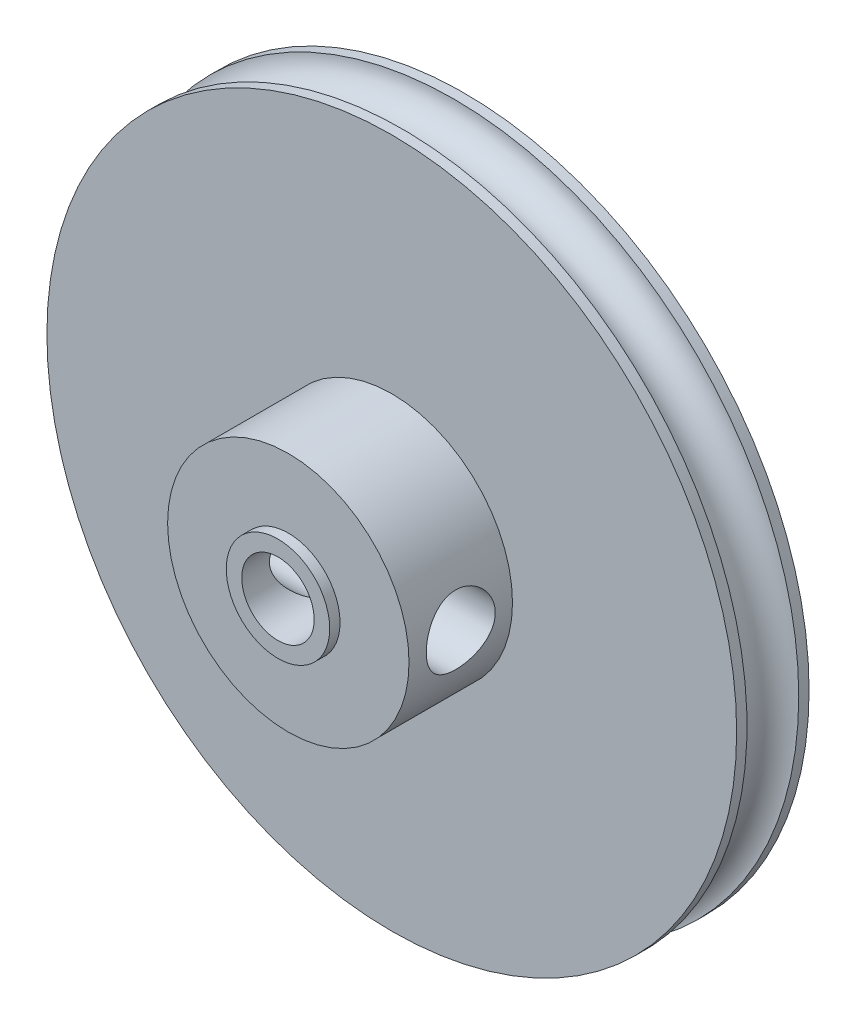
ISO-10303-21;
HEADER;
FILE_DESCRIPTION(('STEP AP214'),'2;1');
FILE_NAME('part.step','',(''),(''),'','','');
FILE_SCHEMA(('AUTOMOTIVE_DESIGN { 1 0 10303 214 1 1 1 1 }'));
ENDSEC;
DATA;
#1=APPLICATION_CONTEXT('core data for automotive mechanical design processes');
#2=APPLICATION_PROTOCOL_DEFINITION('international standard','automotive_design',2000,#1);
#3=PRODUCT_CONTEXT('',#1,'mechanical');
#4=PRODUCT('Part','Part','',(#3));
#5=PRODUCT_RELATED_PRODUCT_CATEGORY('part','',(#4));
#6=PRODUCT_DEFINITION_FORMATION('','',#4);
#7=PRODUCT_DEFINITION_CONTEXT('part definition',#1,'design');
#8=PRODUCT_DEFINITION('design','',#6,#7);
#9=PRODUCT_DEFINITION_SHAPE('','',#8);
#10=(LENGTH_UNIT() NAMED_UNIT(*) SI_UNIT(.MILLI.,.METRE.));
#11=(NAMED_UNIT(*) PLANE_ANGLE_UNIT() SI_UNIT($,.RADIAN.));
#12=(NAMED_UNIT(*) SI_UNIT($,.STERADIAN.) SOLID_ANGLE_UNIT());
#13=UNCERTAINTY_MEASURE_WITH_UNIT(LENGTH_MEASURE(1.E-05),#10,'distance_accuracy_value','');
#14=(GEOMETRIC_REPRESENTATION_CONTEXT(3) GLOBAL_UNCERTAINTY_ASSIGNED_CONTEXT((#13)) GLOBAL_UNIT_ASSIGNED_CONTEXT((#10,
#11,#12)) REPRESENTATION_CONTEXT('',''));
#15=CARTESIAN_POINT('',(0.,0.,0.));
#16=DIRECTION('',(0.,0.,1.));
#17=DIRECTION('',(1.,0.,0.));
#18=AXIS2_PLACEMENT_3D('',#15,#16,#17);
#19=CARTESIAN_POINT('',(0.,0.,0.));
#20=DIRECTION('',(0.,0.,1.));
#21=DIRECTION('',(1.,0.,0.));
#22=AXIS2_PLACEMENT_3D('',#19,#20,#21);
#23=PLANE('',#22);
#24=CARTESIAN_POINT('',(0.,0.,0.));
#25=DIRECTION('',(0.,0.,1.));
#26=DIRECTION('',(1.,0.,0.));
#27=AXIS2_PLACEMENT_3D('',#24,#25,#26);
#28=CIRCLE('',#27,20.);
#29=CARTESIAN_POINT('',(20.,0.,0.));
#30=VERTEX_POINT('',#29);
#31=EDGE_CURVE('E41',#30,#30,#28,.T.);
#32=ORIENTED_EDGE('',*,*,#31,.F.);
#33=EDGE_LOOP('',(#32));
#34=FACE_BOUND('',#33,.T.);
#35=CARTESIAN_POINT('',(0.,0.,0.));
#36=DIRECTION('',(0.,0.,1.));
#37=DIRECTION('',(1.,0.,0.));
#38=AXIS2_PLACEMENT_3D('',#35,#36,#37);
#39=CIRCLE('',#38,3.);
#40=CARTESIAN_POINT('',(3.,0.,0.));
#41=VERTEX_POINT('',#40);
#42=EDGE_CURVE('E10',#41,#41,#39,.F.);
#43=ORIENTED_EDGE('',*,*,#42,.F.);
#44=EDGE_LOOP('',(#43));
#45=FACE_BOUND('',#44,.T.);
#46=ADVANCED_FACE('F30',(#34,#45),#23,.F.);
#47=CARTESIAN_POINT('',(0.,0.,10.2));
#48=DIRECTION('',(0.,0.,1.));
#49=DIRECTION('',(1.,0.,0.));
#50=AXIS2_PLACEMENT_3D('',#47,#48,#49);
#51=PLANE('',#50);
#52=CARTESIAN_POINT('',(0.,0.,10.2));
#53=DIRECTION('',(0.,0.,1.));
#54=DIRECTION('',(1.,0.,0.));
#55=AXIS2_PLACEMENT_3D('',#52,#53,#54);
#56=CIRCLE('',#55,7.);
#57=CARTESIAN_POINT('',(7.,0.,10.2));
#58=VERTEX_POINT('',#57);
#59=EDGE_CURVE('E46',#58,#58,#56,.T.);
#60=ORIENTED_EDGE('',*,*,#59,.T.);
#61=EDGE_LOOP('',(#60));
#62=FACE_BOUND('',#61,.T.);
#63=CARTESIAN_POINT('',(0.,0.,10.2));
#64=DIRECTION('',(0.,0.,1.));
#65=DIRECTION('',(1.,0.,0.));
#66=AXIS2_PLACEMENT_3D('',#63,#64,#65);
#67=CIRCLE('',#66,3.);
#68=CARTESIAN_POINT('',(3.,0.,10.2));
#69=VERTEX_POINT('',#68);
#70=EDGE_CURVE('E97',#69,#69,#67,.T.);
#71=ORIENTED_EDGE('',*,*,#70,.F.);
#72=EDGE_LOOP('',(#71));
#73=FACE_BOUND('',#72,.T.);
#74=ADVANCED_FACE('F112',(#62,#73),#51,.T.);
#75=CARTESIAN_POINT('',(0.,0.,4.2));
#76=DIRECTION('',(0.,0.,-1.));
#77=DIRECTION('',(-1.,0.,0.));
#78=AXIS2_PLACEMENT_3D('',#75,#76,#77);
#79=CYLINDRICAL_SURFACE('',#78,20.);
#80=CARTESIAN_POINT('',(0.,0.,0.599999999999998));
#81=DIRECTION('',(0.,0.,1.));
#82=DIRECTION('',(1.,0.,0.));
#83=AXIS2_PLACEMENT_3D('',#80,#81,#82);
#84=CIRCLE('',#83,20.);
#85=CARTESIAN_POINT('',(20.,0.,0.599999999999998));
#86=VERTEX_POINT('',#85);
#87=EDGE_CURVE('E55',#86,#86,#84,.F.);
#88=ORIENTED_EDGE('',*,*,#87,.T.);
#89=EDGE_LOOP('',(#88));
#90=FACE_BOUND('',#89,.T.);
#91=ORIENTED_EDGE('',*,*,#31,.T.);
#92=EDGE_LOOP('',(#91));
#93=FACE_BOUND('',#92,.T.);
#94=ADVANCED_FACE('F110',(#90,#93),#79,.T.);
#95=CARTESIAN_POINT('',(0.,0.,4.2));
#96=DIRECTION('',(0.,0.,1.));
#97=DIRECTION('',(1.,0.,0.));
#98=AXIS2_PLACEMENT_3D('',#95,#96,#97);
#99=PLANE('',#98);
#100=CARTESIAN_POINT('',(0.,0.,4.2));
#101=DIRECTION('',(0.,0.,1.));
#102=DIRECTION('',(1.,0.,0.));
#103=AXIS2_PLACEMENT_3D('',#100,#101,#102);
#104=CIRCLE('',#103,20.);
#105=CARTESIAN_POINT('',(20.,0.,4.2));
#106=VERTEX_POINT('',#105);
#107=EDGE_CURVE('E37',#106,#106,#104,.T.);
#108=ORIENTED_EDGE('',*,*,#107,.T.);
#109=EDGE_LOOP('',(#108));
#110=FACE_BOUND('',#109,.T.);
#111=CARTESIAN_POINT('',(0.,0.,4.2));
#112=DIRECTION('',(0.,0.,1.));
#113=DIRECTION('',(1.,0.,0.));
#114=AXIS2_PLACEMENT_3D('',#111,#112,#113);
#115=CIRCLE('',#114,7.);
#116=CARTESIAN_POINT('',(7.,0.,4.2));
#117=VERTEX_POINT('',#116);
#118=EDGE_CURVE('E49',#117,#117,#115,.T.);
#119=ORIENTED_EDGE('',*,*,#118,.F.);
#120=EDGE_LOOP('',(#119));
#121=FACE_BOUND('',#120,.T.);
#122=ADVANCED_FACE('F107',(#110,#121),#99,.T.);
#123=CARTESIAN_POINT('',(0.,0.,3.6));
#124=DIRECTION('',(0.,0.,-1.));
#125=DIRECTION('',(-1.,0.,0.));
#126=AXIS2_PLACEMENT_3D('',#123,#124,#125);
#127=CIRCLE('',#126,20.);
#128=CARTESIAN_POINT('',(-20.,0.,3.6));
#129=VERTEX_POINT('',#128);
#130=EDGE_CURVE('E52',#129,#129,#127,.F.);
#131=ORIENTED_EDGE('',*,*,#130,.T.);
#132=EDGE_LOOP('',(#131));
#133=FACE_BOUND('',#132,.T.);
#134=ORIENTED_EDGE('',*,*,#107,.F.);
#135=EDGE_LOOP('',(#134));
#136=FACE_BOUND('',#135,.T.);
#137=ADVANCED_FACE('F32',(#133,#136),#79,.T.);
#138=CARTESIAN_POINT('',(0.,0.,4.2));
#139=DIRECTION('',(0.,0.,-1.));
#140=DIRECTION('',(-1.,0.,0.));
#141=AXIS2_PLACEMENT_3D('',#138,#139,#140);
#142=CYLINDRICAL_SURFACE('',#141,2.1);
#143=CARTESIAN_POINT('',(-2.1,0.,9.2));
#144=CARTESIAN_POINT('',(-2.09999936444777,-0.0909120531068295,9.19999936305237));
#145=CARTESIAN_POINT('',(-2.09404941407997,-0.181828497305162,9.19375459101171));
#146=CARTESIAN_POINT('',(-2.07078384019785,-0.360540363713051,9.16930433295639));
#147=CARTESIAN_POINT('',(-2.05346171614841,-0.448333970577751,9.15109200607077));
#148=CARTESIAN_POINT('',(-2.00898342535596,-0.617752164760208,9.10422387344634));
#149=CARTESIAN_POINT('',(-1.9818897584973,-0.699412060785336,9.07563443359822));
#150=CARTESIAN_POINT('',(-1.91959273879482,-0.855719551880911,9.00968314796344));
#151=CARTESIAN_POINT('',(-1.88438685005886,-0.930364943913561,8.97231855898227));
#152=CARTESIAN_POINT('',(-1.79191274069521,-1.10086565324553,8.87372470670245));
#153=CARTESIAN_POINT('',(-1.73149961401722,-1.19297264887869,8.80897455281074));
#154=CARTESIAN_POINT('',(-1.60203584972586,-1.36193273621251,8.66876143036656));
#155=CARTESIAN_POINT('',(-1.53295940057579,-1.43873839097887,8.59326635373053));
#156=CARTESIAN_POINT('',(-1.41438045254193,-1.55364491436854,8.46134507019631));
#157=CARTESIAN_POINT('',(-1.36628819985549,-1.59598675522613,8.4072570270299));
#158=CARTESIAN_POINT('',(-1.26883193822509,-1.6745089037211,8.29575364466363));
#159=CARTESIAN_POINT('',(-1.21946704621056,-1.71068479274555,8.23833595855358));
#160=CARTESIAN_POINT('',(-1.12070320230365,-1.77695097063386,8.1203362412893));
#161=CARTESIAN_POINT('',(-1.07130445585054,-1.80705164351893,8.05975983610313));
#162=CARTESIAN_POINT('',(-0.973962609140539,-1.86131075474689,7.93495559028042));
#163=CARTESIAN_POINT('',(-0.926017866095766,-1.88547613630838,7.87073212542661));
#164=CARTESIAN_POINT('',(-0.84841520650111,-1.92130932050872,7.75761684719065));
#165=CARTESIAN_POINT('',(-0.817629316139007,-1.93454304647024,7.71000027350925));
#166=CARTESIAN_POINT('',(-0.760126979235264,-1.95784505092686,7.61158254693046));
#167=CARTESIAN_POINT('',(-0.733405575839399,-1.96791720134334,7.56078538146299));
#168=CARTESIAN_POINT('',(-0.69450846594095,-1.98190672778,7.47099962551348));
#169=CARTESIAN_POINT('',(-0.680373525703797,-1.98676400765165,7.4330345194245));
#170=CARTESIAN_POINT('',(-0.657829437137729,-1.99434297697246,7.3552787967315));
#171=CARTESIAN_POINT('',(-0.649400829326005,-1.99707192923939,7.3154948832122));
#172=CARTESIAN_POINT('',(-0.639965795108926,-2.00011881853774,7.23439226072864));
#173=CARTESIAN_POINT('',(-0.639052841206742,-2.00040639342535,7.19306062732735));
#174=CARTESIAN_POINT('',(-0.64515784954926,-1.99844380249053,7.11103768097719));
#175=CARTESIAN_POINT('',(-0.652188079152923,-1.99618971135993,7.07034745713654));
#176=CARTESIAN_POINT('',(-0.675436245609076,-1.98845814436831,6.97933884177808));
#177=CARTESIAN_POINT('',(-0.693725310326469,-1.98223623016253,6.92964469333624));
#178=CARTESIAN_POINT('',(-0.736539578377773,-1.96673102295777,6.83344260453791));
#179=CARTESIAN_POINT('',(-0.761096165254037,-1.9574322515358,6.78695223992798));
#180=CARTESIAN_POINT('',(-0.823231060740887,-1.93229915917793,6.6801608351375));
#181=CARTESIAN_POINT('',(-0.862290661681386,-1.91531819586204,6.62101292525002));
#182=CARTESIAN_POINT('',(-0.943252568509887,-1.87678065714102,6.50620026331942));
#183=CARTESIAN_POINT('',(-0.985159700877122,-1.85521617420299,6.45054174890676));
#184=CARTESIAN_POINT('',(-1.07013735612331,-1.80753607339194,6.34189924015804));
#185=CARTESIAN_POINT('',(-1.113210440254,-1.78140960845504,6.28892201738371));
#186=CARTESIAN_POINT('',(-1.19931902028534,-1.72461484824843,6.18551507400742));
#187=CARTESIAN_POINT('',(-1.24235452043206,-1.69394992515622,6.13508349892652));
#188=CARTESIAN_POINT('',(-1.32914132853706,-1.6268048697706,6.03498566810869));
#189=CARTESIAN_POINT('',(-1.37286632155656,-1.59016096172804,5.98540544115068));
#190=CARTESIAN_POINT('',(-1.45878563740136,-1.51173316783222,5.88907425338676));
#191=CARTESIAN_POINT('',(-1.5009794407027,-1.46994755815747,5.84232424932983));
#192=CARTESIAN_POINT('',(-1.62396024510687,-1.33688790001762,5.70713007675995));
#193=CARTESIAN_POINT('',(-1.70157530932329,-1.23759290888488,5.6232567202644));
#194=CARTESIAN_POINT('',(-1.81798442545077,-1.0547049655713,5.49842029571049));
#195=CARTESIAN_POINT('',(-1.86103414440807,-0.977143981587388,5.45253434502256));
#196=CARTESIAN_POINT('',(-1.93838124715731,-0.81295174408234,5.37037783010725));
#197=CARTESIAN_POINT('',(-1.97268161372561,-0.726323595926394,5.33410398881337));
#198=CARTESIAN_POINT('',(-2.03043383974987,-0.544529390795856,5.27314854760022));
#199=CARTESIAN_POINT('',(-2.0537761128825,-0.449287995888474,5.24858401055333));
#200=CARTESIAN_POINT('',(-2.08692870065803,-0.253964270787182,5.21372169622361));
#201=CARTESIAN_POINT('',(-2.09675577235228,-0.153888094813077,5.20340625189213));
#202=CARTESIAN_POINT('',(-2.10151219360728,0.0324394985192102,5.19841237879532));
#203=CARTESIAN_POINT('',(-2.09839156703384,0.118595849497538,5.20168717184827));
#204=CARTESIAN_POINT('',(-2.08180595299683,0.288772158327035,5.21911048265459));
#205=CARTESIAN_POINT('',(-2.06834065417288,0.37279205179514,5.23325932770192));
#206=CARTESIAN_POINT('',(-2.0327200925021,0.533468828273225,5.27075564767061));
#207=CARTESIAN_POINT('',(-2.0108914347726,0.610281376306745,5.29375753244624));
#208=CARTESIAN_POINT('',(-1.95983519892778,0.758415085839589,5.34769620602605));
#209=CARTESIAN_POINT('',(-1.93060553902089,0.829734694883402,5.37863522746077));
#210=CARTESIAN_POINT('',(-1.85175183065973,0.996433798861548,5.46239650407666));
#211=CARTESIAN_POINT('',(-1.79883443406925,1.08843945467476,5.51883618035073));
#212=CARTESIAN_POINT('',(-1.68399418302239,1.25887923755802,5.64232217166734));
#213=CARTESIAN_POINT('',(-1.62204640129556,1.33727443779169,5.70939789270967));
#214=CARTESIAN_POINT('',(-1.51345851673464,1.45729092785178,5.82852515234493));
#215=CARTESIAN_POINT('',(-1.46838043380915,1.50258677683102,5.87838179749908));
#216=CARTESIAN_POINT('',(-1.37642242049862,1.58725087618376,5.98136166443811));
#217=CARTESIAN_POINT('',(-1.32954247853402,1.62661908845558,6.03448490721693));
#218=CARTESIAN_POINT('',(-1.23490944893019,1.69957788627147,6.14371094181767));
#219=CARTESIAN_POINT('',(-1.18715712403845,1.73317327459833,6.19981120550092));
#220=CARTESIAN_POINT('',(-1.09180423702006,1.79476310897174,6.31507212204544));
#221=CARTESIAN_POINT('',(-1.04420359791366,1.82276108986158,6.37423081356323));
#222=CARTESIAN_POINT('',(-0.958071611281868,1.86925232975418,6.48656662089532));
#223=CARTESIAN_POINT('',(-0.919291279557495,1.88854789796388,6.53922124512638));
#224=CARTESIAN_POINT('',(-0.844557165688998,1.92312347534847,6.64786435392198));
#225=CARTESIAN_POINT('',(-0.808603779256027,1.93840292305226,6.70385330329901));
#226=CARTESIAN_POINT('',(-0.751411667743763,1.96113983093969,6.80518667090947));
#227=CARTESIAN_POINT('',(-0.728780216175578,1.96959802940009,6.84950163045263));
#228=CARTESIAN_POINT('',(-0.689442267774425,1.98371007686842,6.94110923727099));
#229=CARTESIAN_POINT('',(-0.672715344452159,1.98937362148331,6.98839093894626));
#230=CARTESIAN_POINT('',(-0.652079832729457,1.99621625743349,7.07210824582441));
#231=CARTESIAN_POINT('',(-0.645897933073371,1.99820528908419,7.1078937447225));
#232=CARTESIAN_POINT('',(-0.639622059506802,2.00022419522334,7.18002737464794));
#233=CARTESIAN_POINT('',(-0.639518162833114,2.00025726296008,7.21637449172965));
#234=CARTESIAN_POINT('',(-0.645385653958996,1.99837027619063,7.28840046873153));
#235=CARTESIAN_POINT('',(-0.651342039880227,1.99645504458857,7.32408075721998));
#236=CARTESIAN_POINT('',(-0.668224613715924,1.99086784747835,7.39412699623673));
#237=CARTESIAN_POINT('',(-0.67916266985972,1.98719168567749,7.42848959434689));
#238=CARTESIAN_POINT('',(-0.716554890429649,1.97413531620762,7.52732152535654));
#239=CARTESIAN_POINT('',(-0.747909822246716,1.96264624307098,7.58959567017161));
#240=CARTESIAN_POINT('',(-0.816845735656388,1.93498641279416,7.70954826771504));
#241=CARTESIAN_POINT('',(-0.85445850328599,1.91879142171502,7.7672009091226));
#242=CARTESIAN_POINT('',(-0.938121206927564,1.87945769721984,7.88714045311048));
#243=CARTESIAN_POINT('',(-0.984607138407211,1.855655827235,7.94890413134149));
#244=CARTESIAN_POINT('',(-1.078834814866,1.80251411608465,8.0690552809606));
#245=CARTESIAN_POINT('',(-1.12657775774463,1.77316881468873,8.12743934875313));
#246=CARTESIAN_POINT('',(-1.22187665351967,1.70889406223606,8.241123104183));
#247=CARTESIAN_POINT('',(-1.26943273303212,1.673969495474,8.29642543309019));
#248=CARTESIAN_POINT('',(-1.36337497113438,1.59838800192201,8.4039389759824));
#249=CARTESIAN_POINT('',(-1.40976181541342,1.55773453156715,8.45615202705656));
#250=CARTESIAN_POINT('',(-1.52569829143949,1.44631092706975,8.58526501964451));
#251=CARTESIAN_POINT('',(-1.59386962341393,1.37131942821848,8.65984746799935));
#252=CARTESIAN_POINT('',(-1.72203366532522,1.20642871069583,8.79878207388503));
#253=CARTESIAN_POINT('',(-1.78204155733059,1.11655787410048,8.86315326004359));
#254=CARTESIAN_POINT('',(-1.87759949296915,0.944432869334834,8.96511093980821));
#255=CARTESIAN_POINT('',(-1.91559994421402,0.86518616793125,9.00545224547316));
#256=CARTESIAN_POINT('',(-1.98237982455885,0.698704417301444,9.07615695163306));
#257=CARTESIAN_POINT('',(-2.01116737042695,0.611476487333874,9.1065291357469));
#258=CARTESIAN_POINT('',(-2.05562231242813,0.437940582691026,9.15336448118696));
#259=CARTESIAN_POINT('',(-2.07214429814854,0.352100970020471,9.17073452268855));
#260=CARTESIAN_POINT('',(-2.09433075468999,0.177507986575118,9.19404975457857));
#261=CARTESIAN_POINT('',(-2.1000006204802,0.0887560859339268,9.2000006218425));
#262=CARTESIAN_POINT('',(-2.1,0.,9.2));
#263=B_SPLINE_CURVE_WITH_KNOTS('',3,(#143,#144,#145,#146,#147,#148,#149,#150,#151,#152,#153,
#154,#155,#156,#157,#158,#159,#160,#161,#162,#163,#164,#165,#166,#167,#168,#169,#170,#171,#172,
#173,#174,#175,#176,#177,#178,#179,#180,#181,#182,#183,#184,#185,#186,#187,#188,#189,#190,#191,
#192,#193,#194,#195,#196,#197,#198,#199,#200,#201,#202,#203,#204,#205,#206,#207,#208,#209,#210,
#211,#212,#213,#214,#215,#216,#217,#218,#219,#220,#221,#222,#223,#224,#225,#226,#227,#228,#229,
#230,#231,#232,#233,#234,#235,#236,#237,#238,#239,#240,#241,#242,#243,#244,#245,#246,#247,#248,
#249,#250,#251,#252,#253,#254,#255,#256,#257,#258,#259,#260,#261,#262),.UNSPECIFIED.,.T.,.F.,(4,
2,2,2,2,2,2,2,2,2,2,2,2,2,2,2,2,2,2,2,2,2,2,2,2,2,2,2,2,2,2,2,2,2,2,2,2,2,2,2,2,2,2,2,2,2,2,2,2,
2,2,2,2,2,2,2,2,2,2,4),(0.,0.27235496351429,0.544865745641354,0.815663562158306,
1.08654614557868,1.46778625376678,1.85019048695792,2.10146670557706,2.35292224222778,
2.60394427089867,2.85467123535854,3.02916889359116,3.20345200646529,3.32550332745371,
3.44713630919416,3.57027979475175,3.69361372192184,3.85266467866811,4.01252823961348,
4.23074476463427,4.44934085979596,4.66846397196523,4.88742508055558,5.11391964474787,
5.34049035211028,5.79149228762554,6.09009591769963,6.38859761316356,6.69002402274368,
6.99107636573221,7.24856434708557,7.50606007877576,7.75438423846672,8.00277832578953,
8.36143892989467,8.72110900855984,8.96397598638844,9.20684452525088,9.44951001746321,
9.69202177545765,9.89639387022075,10.1007945219121,10.2519164369848,10.4025103063255,
10.5111300799659,10.6195725193034,10.7277471672321,10.8361808873025,11.0469579403677,
11.2588402681987,11.5011462582556,11.7436921739222,11.9860269079425,12.2282160545241,
12.604351347131,12.9797772641265,13.2687980983341,13.5575635934592,13.8235919818834,
14.0894880838865),.UNSPECIFIED.);
#264=CARTESIAN_POINT('',(-2.1,0.,9.2));
#265=VERTEX_POINT('',#264);
#266=EDGE_CURVE('E56',#265,#265,#263,.T.);
#267=ORIENTED_EDGE('',*,*,#266,.F.);
#268=EDGE_LOOP('',(#267));
#269=FACE_BOUND('',#268,.T.);
#270=CARTESIAN_POINT('',(2.1,0.,5.2));
#271=CARTESIAN_POINT('',(2.09999936444777,-0.0909120531068295,5.20000063694763));
#272=CARTESIAN_POINT('',(2.09404941407997,-0.181828497305162,5.20624540898829));
#273=CARTESIAN_POINT('',(2.07078384019785,-0.360540363713051,5.23069566704361));
#274=CARTESIAN_POINT('',(2.05346171614841,-0.448333970577751,5.24890799392923));
#275=CARTESIAN_POINT('',(2.00898342535596,-0.617752164760208,5.29577612655366));
#276=CARTESIAN_POINT('',(1.9818897584973,-0.699412060785336,5.32436556640178));
#277=CARTESIAN_POINT('',(1.91959273879482,-0.855719551880911,5.39031685203656));
#278=CARTESIAN_POINT('',(1.88438685005886,-0.930364943913561,5.42768144101773));
#279=CARTESIAN_POINT('',(1.79191274069521,-1.10086565324553,5.52627529329755));
#280=CARTESIAN_POINT('',(1.73149961401722,-1.19297264887869,5.59102544718926));
#281=CARTESIAN_POINT('',(1.60203584972586,-1.36193273621251,5.73123856963344));
#282=CARTESIAN_POINT('',(1.53295940057579,-1.43873839097887,5.80673364626947));
#283=CARTESIAN_POINT('',(1.41438045254193,-1.55364491436854,5.9386549298037));
#284=CARTESIAN_POINT('',(1.36628819985549,-1.59598675522613,5.9927429729701));
#285=CARTESIAN_POINT('',(1.26883193822509,-1.67450890372109,6.10424635533637));
#286=CARTESIAN_POINT('',(1.21946704621056,-1.71068479274555,6.16166404144642));
#287=CARTESIAN_POINT('',(1.12070320230365,-1.77695097063386,6.2796637587107));
#288=CARTESIAN_POINT('',(1.07130445585054,-1.80705164351893,6.34024016389688));
#289=CARTESIAN_POINT('',(0.973962609140538,-1.86131075474689,6.46504440971958));
#290=CARTESIAN_POINT('',(0.926017866095766,-1.88547613630838,6.52926787457339));
#291=CARTESIAN_POINT('',(0.84841520650111,-1.92130932050872,6.64238315280935));
#292=CARTESIAN_POINT('',(0.817629316139007,-1.93454304647023,6.68999972649075));
#293=CARTESIAN_POINT('',(0.760126979235263,-1.95784505092686,6.78841745306954));
#294=CARTESIAN_POINT('',(0.733405575839398,-1.96791720134334,6.83921461853701));
#295=CARTESIAN_POINT('',(0.694508465940949,-1.98190672778,6.92900037448652));
#296=CARTESIAN_POINT('',(0.680373525703796,-1.98676400765165,6.9669654805755));
#297=CARTESIAN_POINT('',(0.657829437137729,-1.99434297697246,7.04472120326851));
#298=CARTESIAN_POINT('',(0.649400829326006,-1.99707192923939,7.08450511678781));
#299=CARTESIAN_POINT('',(0.639965795108926,-2.00011881853774,7.16560773927136));
#300=CARTESIAN_POINT('',(0.639052841206741,-2.00040639342535,7.20693937267265));
#301=CARTESIAN_POINT('',(0.645157849549259,-1.99844380249053,7.28896231902281));
#302=CARTESIAN_POINT('',(0.652188079152923,-1.99618971135993,7.32965254286346));
#303=CARTESIAN_POINT('',(0.675436245609077,-1.98845814436831,7.42066115822192));
#304=CARTESIAN_POINT('',(0.693725310326469,-1.98223623016253,7.47035530666376));
#305=CARTESIAN_POINT('',(0.736539578377772,-1.96673102295777,7.56655739546209));
#306=CARTESIAN_POINT('',(0.761096165254035,-1.9574322515358,7.61304776007202));
#307=CARTESIAN_POINT('',(0.823231060740884,-1.93229915917794,7.7198391648625));
#308=CARTESIAN_POINT('',(0.862290661681383,-1.91531819586204,7.77898707474997));
#309=CARTESIAN_POINT('',(0.943252568509883,-1.87678065714103,7.89379973668057));
#310=CARTESIAN_POINT('',(0.985159700877117,-1.85521617420299,7.94945825109323));
#311=CARTESIAN_POINT('',(1.07013735612331,-1.80753607339194,8.05810075984195));
#312=CARTESIAN_POINT('',(1.11321044025399,-1.78140960845505,8.11107798261629));
#313=CARTESIAN_POINT('',(1.19931902028534,-1.72461484824844,8.21448492599257));
#314=CARTESIAN_POINT('',(1.24235452043205,-1.69394992515622,8.26491650107347));
#315=CARTESIAN_POINT('',(1.32914132853705,-1.62680486977061,8.3650143318913));
#316=CARTESIAN_POINT('',(1.37286632155656,-1.59016096172805,8.41459455884931));
#317=CARTESIAN_POINT('',(1.45878563740135,-1.51173316783223,8.51092574661324));
#318=CARTESIAN_POINT('',(1.50097944070269,-1.46994755815747,8.55767575067016));
#319=CARTESIAN_POINT('',(1.62396024510686,-1.33688790001762,8.69286992324005));
#320=CARTESIAN_POINT('',(1.70157530932328,-1.23759290888489,8.77674327973559));
#321=CARTESIAN_POINT('',(1.81798442545077,-1.05470496557131,8.90157970428951));
#322=CARTESIAN_POINT('',(1.86103414440807,-0.977143981587398,8.94746565497744));
#323=CARTESIAN_POINT('',(1.9383812471573,-0.812951744082349,9.02962216989275));
#324=CARTESIAN_POINT('',(1.97268161372561,-0.726323595926402,9.06589601118663));
#325=CARTESIAN_POINT('',(2.03043383974987,-0.544529390795863,9.12685145239978));
#326=CARTESIAN_POINT('',(2.0537761128825,-0.449287995888481,9.15141598944667));
#327=CARTESIAN_POINT('',(2.08692870065803,-0.253964270787188,9.18627830377639));
#328=CARTESIAN_POINT('',(2.09675577235228,-0.153888094813083,9.19659374810787));
#329=CARTESIAN_POINT('',(2.10151219360728,0.0324394985192054,9.20158762120468));
#330=CARTESIAN_POINT('',(2.09839156703384,0.118595849497533,9.19831282815173));
#331=CARTESIAN_POINT('',(2.08180595299683,0.288772158327031,9.18088951734541));
#332=CARTESIAN_POINT('',(2.06834065417288,0.372792051795136,9.16674067229808));
#333=CARTESIAN_POINT('',(2.0327200925021,0.533468828273221,9.1292443523294));
#334=CARTESIAN_POINT('',(2.01089143477261,0.610281376306741,9.10624246755376));
#335=CARTESIAN_POINT('',(1.95983519892779,0.758415085839585,9.05230379397396));
#336=CARTESIAN_POINT('',(1.9306055390209,0.829734694883399,9.02136477253923));
#337=CARTESIAN_POINT('',(1.85175183065973,0.996433798861544,8.93760349592334));
#338=CARTESIAN_POINT('',(1.79883443406925,1.08843945467476,8.88116381964928));
#339=CARTESIAN_POINT('',(1.68399418302239,1.25887923755802,8.75767782833267));
#340=CARTESIAN_POINT('',(1.62204640129556,1.33727443779169,8.69060210729033));
#341=CARTESIAN_POINT('',(1.51345851673464,1.45729092785177,8.57147484765508));
#342=CARTESIAN_POINT('',(1.46838043380915,1.50258677683102,8.52161820250093));
#343=CARTESIAN_POINT('',(1.37642242049862,1.58725087618375,8.4186383355619));
#344=CARTESIAN_POINT('',(1.32954247853403,1.62661908845557,8.36551509278308));
#345=CARTESIAN_POINT('',(1.2349094489302,1.69957788627147,8.25628905818234));
#346=CARTESIAN_POINT('',(1.18715712403846,1.73317327459833,8.20018879449908));
#347=CARTESIAN_POINT('',(1.09180423702007,1.79476310897174,8.08492787795457));
#348=CARTESIAN_POINT('',(1.04420359791366,1.82276108986158,8.02576918643678));
#349=CARTESIAN_POINT('',(0.958071611281873,1.86925232975418,7.91343337910469));
#350=CARTESIAN_POINT('',(0.9192912795575,1.88854789796388,7.86077875487363));
#351=CARTESIAN_POINT('',(0.844557165689002,1.92312347534847,7.75213564607803));
#352=CARTESIAN_POINT('',(0.808603779256031,1.93840292305226,7.69614669670099));
#353=CARTESIAN_POINT('',(0.751411667743766,1.96113983093969,7.59481332909054));
#354=CARTESIAN_POINT('',(0.72878021617558,1.96959802940009,7.55049836954738));
#355=CARTESIAN_POINT('',(0.689442267774426,1.98371007686842,7.45889076272901));
#356=CARTESIAN_POINT('',(0.672715344452159,1.98937362148331,7.41160906105374));
#357=CARTESIAN_POINT('',(0.652079832729456,1.99621625743349,7.32789175417559));
#358=CARTESIAN_POINT('',(0.645897933073371,1.99820528908419,7.29210625527751));
#359=CARTESIAN_POINT('',(0.639622059506802,2.00022419522334,7.21997262535206));
#360=CARTESIAN_POINT('',(0.639518162833115,2.00025726296008,7.18362550827036));
#361=CARTESIAN_POINT('',(0.645385653958996,1.99837027619063,7.11159953126847));
#362=CARTESIAN_POINT('',(0.651342039880226,1.99645504458857,7.07591924278002));
#363=CARTESIAN_POINT('',(0.668224613715923,1.99086784747835,7.00587300376327));
#364=CARTESIAN_POINT('',(0.67916266985972,1.98719168567749,6.97151040565311));
#365=CARTESIAN_POINT('',(0.716554890429649,1.97413531620762,6.87267847464346));
#366=CARTESIAN_POINT('',(0.747909822246715,1.96264624307098,6.81040432982839));
#367=CARTESIAN_POINT('',(0.816845735656385,1.93498641279416,6.69045173228496));
#368=CARTESIAN_POINT('',(0.854458503285987,1.91879142171502,6.63279909087741));
#369=CARTESIAN_POINT('',(0.938121206927561,1.87945769721984,6.51285954688953));
#370=CARTESIAN_POINT('',(0.984607138407208,1.855655827235,6.45109586865852));
#371=CARTESIAN_POINT('',(1.078834814866,1.80251411608465,6.3309447190394));
#372=CARTESIAN_POINT('',(1.12657775774463,1.77316881468874,6.27256065124687));
#373=CARTESIAN_POINT('',(1.22187665351966,1.70889406223606,6.15887689581701));
#374=CARTESIAN_POINT('',(1.26943273303212,1.67396949547401,6.10357456690982));
#375=CARTESIAN_POINT('',(1.36337497113437,1.59838800192202,5.99606102401761));
#376=CARTESIAN_POINT('',(1.40976181541341,1.55773453156716,5.94384797294345));
#377=CARTESIAN_POINT('',(1.52569829143949,1.44631092706976,5.8147349803555));
#378=CARTESIAN_POINT('',(1.59386962341393,1.37131942821849,5.74015253200066));
#379=CARTESIAN_POINT('',(1.72203366532522,1.20642871069584,5.60121792611497));
#380=CARTESIAN_POINT('',(1.78204155733058,1.11655787410048,5.53684673995641));
#381=CARTESIAN_POINT('',(1.87759949296915,0.944432869334841,5.43488906019179));
#382=CARTESIAN_POINT('',(1.91559994421402,0.865186167931257,5.39454775452684));
#383=CARTESIAN_POINT('',(1.98237982455885,0.69870441730145,5.32384304836694));
#384=CARTESIAN_POINT('',(2.01116737042695,0.611476487333881,5.2934708642531));
#385=CARTESIAN_POINT('',(2.05562231242813,0.437940582691031,5.24663551881305));
#386=CARTESIAN_POINT('',(2.07214429814854,0.352100970020475,5.22926547731145));
#387=CARTESIAN_POINT('',(2.09433075468999,0.17750798657512,5.20595024542143));
#388=CARTESIAN_POINT('',(2.1000006204802,0.0887560859339279,5.1999993781575));
#389=CARTESIAN_POINT('',(2.1,0.,5.2));
#390=B_SPLINE_CURVE_WITH_KNOTS('',3,(#270,#271,#272,#273,#274,#275,#276,#277,#278,#279,#280,
#281,#282,#283,#284,#285,#286,#287,#288,#289,#290,#291,#292,#293,#294,#295,#296,#297,#298,#299,
#300,#301,#302,#303,#304,#305,#306,#307,#308,#309,#310,#311,#312,#313,#314,#315,#316,#317,#318,
#319,#320,#321,#322,#323,#324,#325,#326,#327,#328,#329,#330,#331,#332,#333,#334,#335,#336,#337,
#338,#339,#340,#341,#342,#343,#344,#345,#346,#347,#348,#349,#350,#351,#352,#353,#354,#355,#356,
#357,#358,#359,#360,#361,#362,#363,#364,#365,#366,#367,#368,#369,#370,#371,#372,#373,#374,#375,
#376,#377,#378,#379,#380,#381,#382,#383,#384,#385,#386,#387,#388,#389),.UNSPECIFIED.,.T.,.F.,(4,
2,2,2,2,2,2,2,2,2,2,2,2,2,2,2,2,2,2,2,2,2,2,2,2,2,2,2,2,2,2,2,2,2,2,2,2,2,2,2,2,2,2,2,2,2,2,2,2,
2,2,2,2,2,2,2,2,2,2,4),(0.,0.27235496351429,0.544865745641354,0.815663562158305,
1.08654614557868,1.46778625376678,1.85019048695792,2.10146670557705,2.35292224222778,
2.60394427089867,2.85467123535854,3.02916889359116,3.20345200646529,3.32550332745371,
3.44713630919416,3.57027979475175,3.69361372192183,3.85266467866811,4.01252823961347,
4.23074476463426,4.44934085979595,4.66846397196521,4.88742508055557,5.11391964474786,
5.34049035211027,5.79149228762553,6.09009591769962,6.38859761316355,6.69002402274368,
6.9910763657322,7.24856434708556,7.50606007877576,7.75438423846672,8.00277832578952,
8.36143892989467,8.72110900855984,8.96397598638843,9.20684452525087,9.4495100174632,
9.69202177545765,9.89639387022075,10.1007945219121,10.2519164369848,10.4025103063255,
10.5111300799659,10.6195725193034,10.727747167232,10.8361808873025,11.0469579403677,
11.2588402681987,11.5011462582556,11.7436921739222,11.9860269079425,12.2282160545241,
12.604351347131,12.9797772641265,13.2687980983341,13.5575635934592,13.8235919818834,
14.0894880838865),.UNSPECIFIED.);
#391=CARTESIAN_POINT('',(2.1,0.,5.2));
#392=VERTEX_POINT('',#391);
#393=EDGE_CURVE('E91',#392,#392,#390,.T.);
#394=ORIENTED_EDGE('',*,*,#393,.F.);
#395=EDGE_LOOP('',(#394));
#396=FACE_BOUND('',#395,.T.);
#397=CARTESIAN_POINT('',(0.,0.,10.8));
#398=DIRECTION('',(0.,0.,1.));
#399=DIRECTION('',(1.,0.,0.));
#400=AXIS2_PLACEMENT_3D('',#397,#398,#399);
#401=CIRCLE('',#400,2.1);
#402=CARTESIAN_POINT('',(2.1,0.,10.8));
#403=VERTEX_POINT('',#402);
#404=EDGE_CURVE('E158',#403,#403,#401,.T.);
#405=ORIENTED_EDGE('',*,*,#404,.T.);
#406=EDGE_LOOP('',(#405));
#407=FACE_BOUND('',#406,.T.);
#408=CARTESIAN_POINT('',(0.,0.,-0.5));
#409=DIRECTION('',(0.,0.,-1.));
#410=DIRECTION('',(-1.,0.,0.));
#411=AXIS2_PLACEMENT_3D('',#408,#409,#410);
#412=CIRCLE('',#411,2.1);
#413=CARTESIAN_POINT('',(-2.1,0.,-0.5));
#414=VERTEX_POINT('',#413);
#415=EDGE_CURVE('E166',#414,#414,#412,.T.);
#416=ORIENTED_EDGE('',*,*,#415,.T.);
#417=EDGE_LOOP('',(#416));
#418=FACE_BOUND('',#417,.T.);
#419=ADVANCED_FACE('F102',(#269,#396,#407,#418),#142,.F.);
#420=CARTESIAN_POINT('',(0.,0.,10.2));
#421=DIRECTION('',(0.,0.,-1.));
#422=DIRECTION('',(-1.,0.,0.));
#423=AXIS2_PLACEMENT_3D('',#420,#421,#422);
#424=CYLINDRICAL_SURFACE('',#423,7.);
#425=CARTESIAN_POINT('',(-7.,0.,9.2));
#426=CARTESIAN_POINT('',(-6.99999869294341,-0.109954902377251,9.19999806043806));
#427=CARTESIAN_POINT('',(-6.99738417402043,-0.219929747872582,9.19090221102389));
#428=CARTESIAN_POINT('',(-6.98720905945103,-0.436691991196989,9.15483572989769));
#429=CARTESIAN_POINT('',(-6.97964659210084,-0.543478166829616,9.12785833392591));
#430=CARTESIAN_POINT('',(-6.96040691349073,-0.750704300737871,9.0569919615835));
#431=CARTESIAN_POINT('',(-6.94873544106341,-0.851152880848225,9.01312656384805));
#432=CARTESIAN_POINT('',(-6.92249978316544,-1.04326876112927,8.90982200852165));
#433=CARTESIAN_POINT('',(-6.90793529508022,-1.13493514117816,8.85038122150964));
#434=CARTESIAN_POINT('',(-6.8770473462558,-1.30929444685895,8.71596498932709));
#435=CARTESIAN_POINT('',(-6.86069041945191,-1.39172372238094,8.64065524614473));
#436=CARTESIAN_POINT('',(-6.82826734915641,-1.54297135792435,8.47735225686232));
#437=CARTESIAN_POINT('',(-6.81220124959344,-1.61178767707782,8.38935711236777));
#438=CARTESIAN_POINT('',(-6.78183014875388,-1.7351979000643,8.20100641720909));
#439=CARTESIAN_POINT('',(-6.76756702506018,-1.78947821103348,8.10043801493514));
#440=CARTESIAN_POINT('',(-6.74291343840667,-1.8802517055398,7.89112798824924));
#441=CARTESIAN_POINT('',(-6.73252214244871,-1.91674871555719,7.78238812792911));
#442=CARTESIAN_POINT('',(-6.71713608196016,-1.96998433013875,7.56276523683446));
#443=CARTESIAN_POINT('',(-6.71200978570011,-1.9872055320285,7.45200863723217));
#444=CARTESIAN_POINT('',(-6.70734208201995,-2.00290667789184,7.2290688515539));
#445=CARTESIAN_POINT('',(-6.70779946107612,-2.00139069409621,7.11688598074978));
#446=CARTESIAN_POINT('',(-6.71413034409934,-1.98004134762903,6.89813138854384));
#447=CARTESIAN_POINT('',(-6.71982782697936,-1.96080325728391,6.79149564881924));
#448=CARTESIAN_POINT('',(-6.73571348382811,-1.90551386085789,6.58303278037241));
#449=CARTESIAN_POINT('',(-6.74590206376403,-1.8694610348125,6.4812060872795));
#450=CARTESIAN_POINT('',(-6.7697686351608,-1.78110681137812,6.28375375556819));
#451=CARTESIAN_POINT('',(-6.78348916405649,-1.72860551172881,6.18822292759833));
#452=CARTESIAN_POINT('',(-6.81285216882059,-1.60898379167885,6.00712343878659));
#453=CARTESIAN_POINT('',(-6.82849507221912,-1.54186011673345,5.92155700226509));
#454=CARTESIAN_POINT('',(-6.86066250656356,-1.39190399673021,5.75942762439363));
#455=CARTESIAN_POINT('',(-6.87719804572366,-1.30857487484533,5.68332552403277));
#456=CARTESIAN_POINT('',(-6.90876247218345,-1.13013228238622,5.54607399635972));
#457=CARTESIAN_POINT('',(-6.92379128137825,-1.03501820148189,5.48492534395829));
#458=CARTESIAN_POINT('',(-6.95076528065502,-0.834923073091445,5.37907126522596));
#459=CARTESIAN_POINT('',(-6.96269275497229,-0.729889817810004,5.33445971319582));
#460=CARTESIAN_POINT('',(-6.98199251487585,-0.513393229967468,5.26366610858318));
#461=CARTESIAN_POINT('',(-6.98936594856255,-0.401931525810145,5.23747941075473));
#462=CARTESIAN_POINT('',(-6.99854874514672,-0.179666388644349,5.20502671429055));
#463=CARTESIAN_POINT('',(-7.00053272850599,-0.0689613468605073,5.19813530462697));
#464=CARTESIAN_POINT('',(-6.99922084707091,0.152026526805583,5.20272726630104));
#465=CARTESIAN_POINT('',(-6.99592561580629,0.262309407757108,5.21420843284592));
#466=CARTESIAN_POINT('',(-6.98453926685206,0.477018633430315,5.25471044431625));
#467=CARTESIAN_POINT('',(-6.97654613017679,0.581518211734843,5.28337318132339));
#468=CARTESIAN_POINT('',(-6.95667998741883,0.78420868620564,5.35700050198467));
#469=CARTESIAN_POINT('',(-6.94480653265874,0.882398851248717,5.40196697088933));
#470=CARTESIAN_POINT('',(-6.91809961169145,1.07204168512003,5.50802333664512));
#471=CARTESIAN_POINT('',(-6.9032076317834,1.16330248654009,5.56944119882533));
#472=CARTESIAN_POINT('',(-6.87217947098441,1.33443852805947,5.7062525059511));
#473=CARTESIAN_POINT('',(-6.85604300755107,1.41431117084304,5.78164913006457));
#474=CARTESIAN_POINT('',(-6.82368619629443,1.56310642834007,5.94720934204944));
#475=CARTESIAN_POINT('',(-6.80748036858305,1.63158542740713,6.03777527555905));
#476=CARTESIAN_POINT('',(-6.77738894734786,1.75239531606757,6.22946258862467));
#477=CARTESIAN_POINT('',(-6.76350327310608,1.8047267674867,6.33058360077126));
#478=CARTESIAN_POINT('',(-6.73978651242836,1.89137454118278,6.54009121097522));
#479=CARTESIAN_POINT('',(-6.72993400029434,1.92578633239654,6.64843576349762));
#480=CARTESIAN_POINT('',(-6.71542456669526,1.9757945006787,6.86970993557479));
#481=CARTESIAN_POINT('',(-6.71076607094366,1.99139657901587,6.98263815507641));
#482=CARTESIAN_POINT('',(-6.70731703127619,2.00298024246851,7.20529603293678));
#483=CARTESIAN_POINT('',(-6.70831160808103,1.99968027644405,7.31498550455666));
#484=CARTESIAN_POINT('',(-6.71554597206102,1.97524710957466,7.53217473066169));
#485=CARTESIAN_POINT('',(-6.72178558421114,1.95411450379873,7.63967455809192));
#486=CARTESIAN_POINT('',(-6.73866977160527,1.89505968816675,7.8483783711686));
#487=CARTESIAN_POINT('',(-6.74926877048974,1.85731091786365,7.94963538701117));
#488=CARTESIAN_POINT('',(-6.77367302842112,1.76622949301581,8.1444587344922));
#489=CARTESIAN_POINT('',(-6.78747885482392,1.71289408043152,8.23802370127323));
#490=CARTESIAN_POINT('',(-6.81731668949935,1.59006546534828,8.41818352180533));
#491=CARTESIAN_POINT('',(-6.83340763179064,1.52009227722732,8.50444139134196));
#492=CARTESIAN_POINT('',(-6.86569845092232,1.36685984037935,8.66422389580981));
#493=CARTESIAN_POINT('',(-6.88189835417168,1.28359725072856,8.7377453191108));
#494=CARTESIAN_POINT('',(-6.91307959572365,1.10357432086539,8.87183718432662));
#495=CARTESIAN_POINT('',(-6.92801901037413,1.00652250235978,8.93202698726963));
#496=CARTESIAN_POINT('',(-6.95451395777971,0.803250529646661,9.03514578502201));
#497=CARTESIAN_POINT('',(-6.96607133870287,0.697035424114739,9.07808421193307));
#498=CARTESIAN_POINT('',(-6.98327344725308,0.492916315335035,9.14084755139545));
#499=CARTESIAN_POINT('',(-6.98949684362076,0.395763007624391,9.16297353668456));
#500=CARTESIAN_POINT('',(-6.99786043852147,0.199078368786368,9.19254965724214));
#501=CARTESIAN_POINT('',(-7.00000118333996,0.0995473576160919,9.20000175597688));
#502=CARTESIAN_POINT('',(-7.,0.,9.2));
#503=B_SPLINE_CURVE_WITH_KNOTS('',3,(#425,#426,#427,#428,#429,#430,#431,#432,#433,#434,#435,
#436,#437,#438,#439,#440,#441,#442,#443,#444,#445,#446,#447,#448,#449,#450,#451,#452,#453,#454,
#455,#456,#457,#458,#459,#460,#461,#462,#463,#464,#465,#466,#467,#468,#469,#470,#471,#472,#473,
#474,#475,#476,#477,#478,#479,#480,#481,#482,#483,#484,#485,#486,#487,#488,#489,#490,#491,#492,
#493,#494,#495,#496,#497,#498,#499,#500,#501,#502),.UNSPECIFIED.,.T.,.F.,(4,2,2,2,2,2,2,2,2,2,2,
2,2,2,2,2,2,2,2,2,2,2,2,2,2,2,2,2,2,2,2,2,2,2,2,2,2,2,4),(0.,0.329499312542344,0.65912333979518,
0.988288812895344,1.31748873543516,1.65447811530781,1.99151797873713,2.33533075300057,
2.6790695154481,3.0139950986275,3.34884789231233,3.67284785829333,3.99687711786126,
4.3250080329121,4.65321205577343,4.99378500602502,5.33437560155449,5.67687101104449,
6.01928004014613,6.35045457698201,6.68158937434649,7.0060514047952,7.33055096575529,
7.66207525344452,7.99367503187788,8.33612104884335,8.67855514965299,9.01914573366139,
9.35963305787734,9.68726681616473,10.0148896418598,10.3391709629126,10.6635096999758,
10.9986765689036,11.3339278310847,11.6777797897016,12.0214434923409,12.3197946803794,
12.6181059442772),.UNSPECIFIED.);
#504=CARTESIAN_POINT('',(-7.,0.,9.2));
#505=VERTEX_POINT('',#504);
#506=EDGE_CURVE('E66',#505,#505,#503,.T.);
#507=ORIENTED_EDGE('',*,*,#506,.T.);
#508=EDGE_LOOP('',(#507));
#509=FACE_BOUND('',#508,.T.);
#510=CARTESIAN_POINT('',(7.,0.,5.2));
#511=CARTESIAN_POINT('',(6.99999869294341,-0.109954902377251,5.20000193956195));
#512=CARTESIAN_POINT('',(6.99738417402043,-0.219929747872581,5.20909778897611));
#513=CARTESIAN_POINT('',(6.98720905945103,-0.436691991196989,5.24516427010231));
#514=CARTESIAN_POINT('',(6.97964659210084,-0.543478166829616,5.27214166607409));
#515=CARTESIAN_POINT('',(6.96040691349073,-0.750704300737871,5.3430080384165));
#516=CARTESIAN_POINT('',(6.94873544106341,-0.851152880848224,5.38687343615195));
#517=CARTESIAN_POINT('',(6.92249978316544,-1.04326876112927,5.49017799147835));
#518=CARTESIAN_POINT('',(6.90793529508022,-1.13493514117816,5.54961877849036));
#519=CARTESIAN_POINT('',(6.8770473462558,-1.30929444685895,5.68403501067291));
#520=CARTESIAN_POINT('',(6.86069041945191,-1.39172372238094,5.75934475385527));
#521=CARTESIAN_POINT('',(6.82826734915641,-1.54297135792435,5.92264774313768));
#522=CARTESIAN_POINT('',(6.81220124959344,-1.61178767707783,6.01064288763223));
#523=CARTESIAN_POINT('',(6.78183014875388,-1.7351979000643,6.19899358279091));
#524=CARTESIAN_POINT('',(6.76756702506018,-1.78947821103348,6.29956198506486));
#525=CARTESIAN_POINT('',(6.74291343840667,-1.8802517055398,6.50887201175077));
#526=CARTESIAN_POINT('',(6.73252214244871,-1.91674871555719,6.61761187207089));
#527=CARTESIAN_POINT('',(6.71713608196016,-1.96998433013875,6.83723476316554));
#528=CARTESIAN_POINT('',(6.71200978570011,-1.9872055320285,6.94799136276784));
#529=CARTESIAN_POINT('',(6.70734208201995,-2.00290667789184,7.1709311484461));
#530=CARTESIAN_POINT('',(6.70779946107612,-2.00139069409621,7.28311401925022));
#531=CARTESIAN_POINT('',(6.71413034409934,-1.98004134762903,7.50186861145616));
#532=CARTESIAN_POINT('',(6.71982782697936,-1.96080325728391,7.60850435118076));
#533=CARTESIAN_POINT('',(6.73571348382811,-1.90551386085789,7.8169672196276));
#534=CARTESIAN_POINT('',(6.74590206376403,-1.8694610348125,7.9187939127205));
#535=CARTESIAN_POINT('',(6.7697686351608,-1.78110681137812,8.11624624443181));
#536=CARTESIAN_POINT('',(6.78348916405649,-1.72860551172881,8.21177707240168));
#537=CARTESIAN_POINT('',(6.81285216882059,-1.60898379167885,8.39287656121341));
#538=CARTESIAN_POINT('',(6.82849507221912,-1.54186011673345,8.47844299773491));
#539=CARTESIAN_POINT('',(6.86066250656356,-1.39190399673021,8.64057237560637));
#540=CARTESIAN_POINT('',(6.87719804572366,-1.30857487484533,8.71667447596723));
#541=CARTESIAN_POINT('',(6.90876247218344,-1.13013228238622,8.85392600364028));
#542=CARTESIAN_POINT('',(6.92379128137825,-1.03501820148189,8.91507465604171));
#543=CARTESIAN_POINT('',(6.95076528065502,-0.834923073091445,9.02092873477404));
#544=CARTESIAN_POINT('',(6.96269275497229,-0.729889817810004,9.06554028680418));
#545=CARTESIAN_POINT('',(6.98199251487585,-0.513393229967469,9.13633389141682));
#546=CARTESIAN_POINT('',(6.98936594856255,-0.401931525810146,9.16252058924527));
#547=CARTESIAN_POINT('',(6.99854874514672,-0.179666388644349,9.19497328570946));
#548=CARTESIAN_POINT('',(7.00053272850599,-0.0689613468605076,9.20186469537303));
#549=CARTESIAN_POINT('',(6.99922084707091,0.152026526805583,9.19727273369896));
#550=CARTESIAN_POINT('',(6.99592561580629,0.262309407757108,9.18579156715408));
#551=CARTESIAN_POINT('',(6.98453926685206,0.477018633430315,9.14528955568375));
#552=CARTESIAN_POINT('',(6.97654613017679,0.581518211734843,9.11662681867661));
#553=CARTESIAN_POINT('',(6.95667998741883,0.784208686205641,9.04299949801533));
#554=CARTESIAN_POINT('',(6.94480653265874,0.882398851248718,8.99803302911067));
#555=CARTESIAN_POINT('',(6.91809961169145,1.07204168512003,8.89197666335488));
#556=CARTESIAN_POINT('',(6.9032076317834,1.16330248654009,8.83055880117467));
#557=CARTESIAN_POINT('',(6.87217947098441,1.33443852805947,8.69374749404891));
#558=CARTESIAN_POINT('',(6.85604300755107,1.41431117084304,8.61835086993543));
#559=CARTESIAN_POINT('',(6.82368619629443,1.56310642834007,8.45279065795056));
#560=CARTESIAN_POINT('',(6.80748036858305,1.63158542740713,8.36222472444096));
#561=CARTESIAN_POINT('',(6.77738894734787,1.75239531606757,8.17053741137533));
#562=CARTESIAN_POINT('',(6.76350327310608,1.8047267674867,8.06941639922874));
#563=CARTESIAN_POINT('',(6.73978651242836,1.89137454118278,7.85990878902479));
#564=CARTESIAN_POINT('',(6.72993400029434,1.92578633239654,7.75156423650239));
#565=CARTESIAN_POINT('',(6.71542456669526,1.9757945006787,7.53029006442521));
#566=CARTESIAN_POINT('',(6.71076607094366,1.99139657901587,7.41736184492359));
#567=CARTESIAN_POINT('',(6.70731703127619,2.00298024246851,7.19470396706322));
#568=CARTESIAN_POINT('',(6.70831160808103,1.99968027644405,7.08501449544334));
#569=CARTESIAN_POINT('',(6.71554597206102,1.97524710957466,6.86782526933831));
#570=CARTESIAN_POINT('',(6.72178558421114,1.95411450379873,6.76032544190809));
#571=CARTESIAN_POINT('',(6.73866977160527,1.89505968816675,6.5516216288314));
#572=CARTESIAN_POINT('',(6.74926877048974,1.85731091786365,6.45036461298883));
#573=CARTESIAN_POINT('',(6.77367302842112,1.76622949301581,6.25554126550781));
#574=CARTESIAN_POINT('',(6.78747885482392,1.71289408043152,6.16197629872677));
#575=CARTESIAN_POINT('',(6.81731668949935,1.59006546534828,5.98181647819467));
#576=CARTESIAN_POINT('',(6.83340763179064,1.52009227722732,5.89555860865804));
#577=CARTESIAN_POINT('',(6.86569845092232,1.36685984037935,5.73577610419019));
#578=CARTESIAN_POINT('',(6.88189835417168,1.28359725072856,5.6622546808892));
#579=CARTESIAN_POINT('',(6.91307959572365,1.10357432086539,5.52816281567338));
#580=CARTESIAN_POINT('',(6.92801901037413,1.00652250235978,5.46797301273037));
#581=CARTESIAN_POINT('',(6.95451395777971,0.803250529646662,5.36485421497799));
#582=CARTESIAN_POINT('',(6.96607133870287,0.697035424114739,5.32191578806694));
#583=CARTESIAN_POINT('',(6.98327344725308,0.492916315335034,5.25915244860455));
#584=CARTESIAN_POINT('',(6.98949684362076,0.395763007624389,5.23702646331544));
#585=CARTESIAN_POINT('',(6.99786043852147,0.199078368786366,5.20745034275786));
#586=CARTESIAN_POINT('',(7.00000118333996,0.0995473576160912,5.19999824402312));
#587=CARTESIAN_POINT('',(7.,0.,5.2));
#588=B_SPLINE_CURVE_WITH_KNOTS('',3,(#510,#511,#512,#513,#514,#515,#516,#517,#518,#519,#520,
#521,#522,#523,#524,#525,#526,#527,#528,#529,#530,#531,#532,#533,#534,#535,#536,#537,#538,#539,
#540,#541,#542,#543,#544,#545,#546,#547,#548,#549,#550,#551,#552,#553,#554,#555,#556,#557,#558,
#559,#560,#561,#562,#563,#564,#565,#566,#567,#568,#569,#570,#571,#572,#573,#574,#575,#576,#577,
#578,#579,#580,#581,#582,#583,#584,#585,#586,#587),.UNSPECIFIED.,.T.,.F.,(4,2,2,2,2,2,2,2,2,2,2,
2,2,2,2,2,2,2,2,2,2,2,2,2,2,2,2,2,2,2,2,2,2,2,2,2,2,2,4),(0.,0.329499312542344,0.65912333979518,
0.988288812895343,1.31748873543516,1.65447811530782,1.99151797873713,2.33533075300057,
2.6790695154481,3.0139950986275,3.34884789231233,3.67284785829333,3.99687711786126,
4.3250080329121,4.65321205577343,4.99378500602502,5.33437560155449,5.67687101104449,
6.01928004014612,6.35045457698201,6.68158937434649,7.0060514047952,7.33055096575529,
7.66207525344452,7.99367503187788,8.33612104884334,8.67855514965298,9.01914573366139,
9.35963305787734,9.68726681616472,10.0148896418598,10.3391709629126,10.6635096999758,
10.9986765689036,11.3339278310847,11.6777797897016,12.0214434923409,12.3197946803794,
12.6181059442772),.UNSPECIFIED.);
#589=CARTESIAN_POINT('',(7.,0.,5.2));
#590=VERTEX_POINT('',#589);
#591=EDGE_CURVE('E59',#590,#590,#588,.T.);
#592=ORIENTED_EDGE('',*,*,#591,.T.);
#593=EDGE_LOOP('',(#592));
#594=FACE_BOUND('',#593,.T.);
#595=ORIENTED_EDGE('',*,*,#59,.F.);
#596=EDGE_LOOP('',(#595));
#597=FACE_BOUND('',#596,.T.);
#598=ORIENTED_EDGE('',*,*,#118,.T.);
#599=EDGE_LOOP('',(#598));
#600=FACE_BOUND('',#599,.T.);
#601=ADVANCED_FACE('F71',(#509,#594,#597,#600),#424,.T.);
#602=CARTESIAN_POINT('',(0.,0.,2.1));
#603=DIRECTION('',(0.,0.,-1.));
#604=DIRECTION('',(-1.,0.,0.));
#605=AXIS2_PLACEMENT_3D('',#602,#603,#604);
#606=TOROIDAL_SURFACE('',#605,20.,1.5);
#607=ORIENTED_EDGE('',*,*,#130,.F.);
#608=EDGE_LOOP('',(#607));
#609=FACE_BOUND('',#608,.T.);
#610=ORIENTED_EDGE('',*,*,#87,.F.);
#611=EDGE_LOOP('',(#610));
#612=FACE_BOUND('',#611,.T.);
#613=ADVANCED_FACE('F85',(#609,#612),#606,.F.);
#614=CARTESIAN_POINT('',(-20.,0.,7.2));
#615=DIRECTION('',(1.,0.,0.));
#616=DIRECTION('',(0.,0.,-1.));
#617=AXIS2_PLACEMENT_3D('',#614,#615,#616);
#618=CYLINDRICAL_SURFACE('',#617,2.);
#619=ORIENTED_EDGE('',*,*,#393,.T.);
#620=EDGE_LOOP('',(#619));
#621=FACE_BOUND('',#620,.T.);
#622=ORIENTED_EDGE('',*,*,#591,.F.);
#623=EDGE_LOOP('',(#622));
#624=FACE_BOUND('',#623,.T.);
#625=ADVANCED_FACE('F81',(#621,#624),#618,.F.);
#626=ORIENTED_EDGE('',*,*,#266,.T.);
#627=EDGE_LOOP('',(#626));
#628=FACE_BOUND('',#627,.T.);
#629=ORIENTED_EDGE('',*,*,#506,.F.);
#630=EDGE_LOOP('',(#629));
#631=FACE_BOUND('',#630,.T.);
#632=ADVANCED_FACE('F75',(#628,#631),#618,.F.);
#633=CARTESIAN_POINT('',(0.,0.,10.8));
#634=DIRECTION('',(0.,0.,1.));
#635=DIRECTION('',(1.,0.,0.));
#636=AXIS2_PLACEMENT_3D('',#633,#634,#635);
#637=PLANE('',#636);
#638=CARTESIAN_POINT('',(0.,0.,10.8));
#639=DIRECTION('',(0.,0.,1.));
#640=DIRECTION('',(1.,0.,0.));
#641=AXIS2_PLACEMENT_3D('',#638,#639,#640);
#642=CIRCLE('',#641,3.);
#643=CARTESIAN_POINT('',(3.,0.,10.8));
#644=VERTEX_POINT('',#643);
#645=EDGE_CURVE('E67',#644,#644,#642,.T.);
#646=ORIENTED_EDGE('',*,*,#645,.T.);
#647=EDGE_LOOP('',(#646));
#648=FACE_BOUND('',#647,.T.);
#649=ORIENTED_EDGE('',*,*,#404,.F.);
#650=EDGE_LOOP('',(#649));
#651=FACE_BOUND('',#650,.T.);
#652=ADVANCED_FACE('F80',(#648,#651),#637,.T.);
#653=CARTESIAN_POINT('',(0.,0.,10.8));
#654=DIRECTION('',(0.,0.,-1.));
#655=DIRECTION('',(-1.,0.,0.));
#656=AXIS2_PLACEMENT_3D('',#653,#654,#655);
#657=CYLINDRICAL_SURFACE('',#656,3.);
#658=ORIENTED_EDGE('',*,*,#645,.F.);
#659=EDGE_LOOP('',(#658));
#660=FACE_BOUND('',#659,.T.);
#661=ORIENTED_EDGE('',*,*,#70,.T.);
#662=EDGE_LOOP('',(#661));
#663=FACE_BOUND('',#662,.T.);
#664=ADVANCED_FACE('F83',(#660,#663),#657,.T.);
#665=CARTESIAN_POINT('',(0.,0.,-0.5));
#666=DIRECTION('',(0.,0.,-1.));
#667=DIRECTION('',(-1.,0.,0.));
#668=AXIS2_PLACEMENT_3D('',#665,#666,#667);
#669=PLANE('',#668);
#670=CARTESIAN_POINT('',(0.,0.,-0.5));
#671=DIRECTION('',(0.,0.,-1.));
#672=DIRECTION('',(-1.,0.,0.));
#673=AXIS2_PLACEMENT_3D('',#670,#671,#672);
#674=CIRCLE('',#673,3.);
#675=CARTESIAN_POINT('',(-3.,0.,-0.5));
#676=VERTEX_POINT('',#675);
#677=EDGE_CURVE('E161',#676,#676,#674,.T.);
#678=ORIENTED_EDGE('',*,*,#677,.T.);
#679=EDGE_LOOP('',(#678));
#680=FACE_BOUND('',#679,.T.);
#681=ORIENTED_EDGE('',*,*,#415,.F.);
#682=EDGE_LOOP('',(#681));
#683=FACE_BOUND('',#682,.T.);
#684=ADVANCED_FACE('F173',(#680,#683),#669,.T.);
#685=CARTESIAN_POINT('',(0.,0.,-0.5));
#686=DIRECTION('',(0.,0.,1.));
#687=DIRECTION('',(1.,0.,0.));
#688=AXIS2_PLACEMENT_3D('',#685,#686,#687);
#689=CYLINDRICAL_SURFACE('',#688,3.);
#690=ORIENTED_EDGE('',*,*,#677,.F.);
#691=EDGE_LOOP('',(#690));
#692=FACE_BOUND('',#691,.T.);
#693=ORIENTED_EDGE('',*,*,#42,.T.);
#694=EDGE_LOOP('',(#693));
#695=FACE_BOUND('',#694,.T.);
#696=ADVANCED_FACE('F175',(#692,#695),#689,.T.);
#697=CLOSED_SHELL('',(#46,#74,#94,#122,#137,#419,#601,#613,#625,#632,#652,#664,#684,#696));
#698=MANIFOLD_SOLID_BREP('B2',#697);
#699=ADVANCED_BREP_SHAPE_REPRESENTATION('',(#18,#698),#14);
#700=SHAPE_DEFINITION_REPRESENTATION(#9,#699);
ENDSEC;
END-ISO-10303-21;
